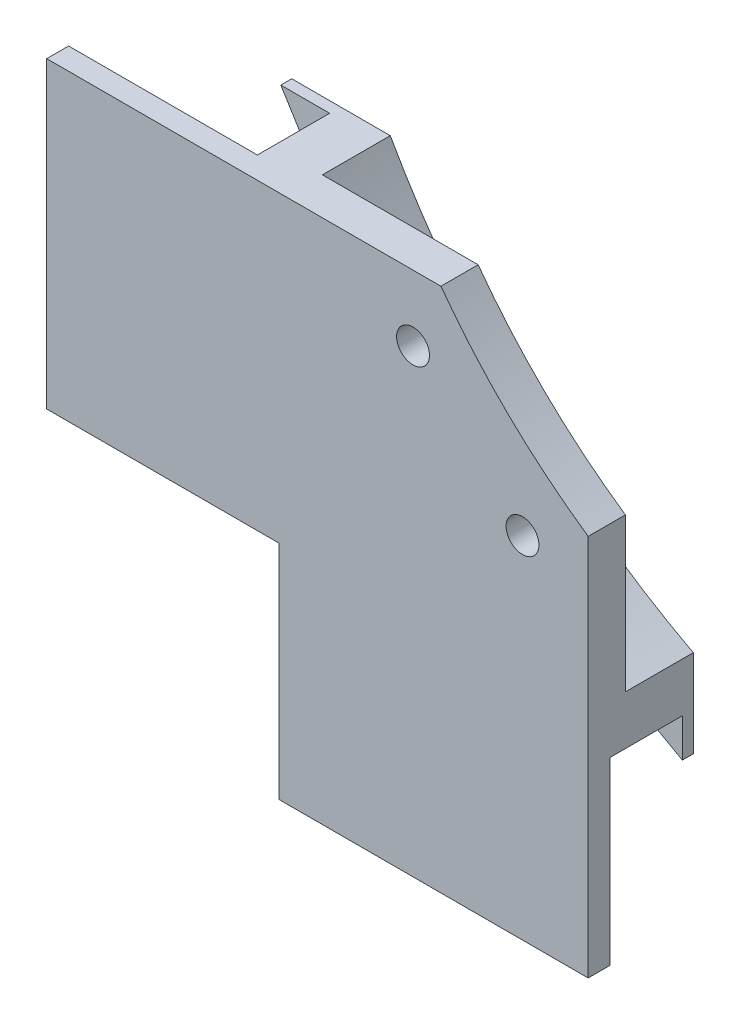
ISO-10303-21;
HEADER;
FILE_DESCRIPTION(('STEP AP214'),'2;1');
FILE_NAME('part.step','',(''),(''),'','','');
FILE_SCHEMA(('AUTOMOTIVE_DESIGN { 1 0 10303 214 1 1 1 1 }'));
ENDSEC;
DATA;
#1=APPLICATION_CONTEXT('core data for automotive mechanical design processes');
#2=APPLICATION_PROTOCOL_DEFINITION('international standard','automotive_design',2000,#1);
#3=PRODUCT_CONTEXT('',#1,'mechanical');
#4=PRODUCT('Part','Part','',(#3));
#5=PRODUCT_RELATED_PRODUCT_CATEGORY('part','',(#4));
#6=PRODUCT_DEFINITION_FORMATION('','',#4);
#7=PRODUCT_DEFINITION_CONTEXT('part definition',#1,'design');
#8=PRODUCT_DEFINITION('design','',#6,#7);
#9=PRODUCT_DEFINITION_SHAPE('','',#8);
#10=(LENGTH_UNIT() NAMED_UNIT(*) SI_UNIT(.MILLI.,.METRE.));
#11=(NAMED_UNIT(*) PLANE_ANGLE_UNIT() SI_UNIT($,.RADIAN.));
#12=(NAMED_UNIT(*) SI_UNIT($,.STERADIAN.) SOLID_ANGLE_UNIT());
#13=UNCERTAINTY_MEASURE_WITH_UNIT(LENGTH_MEASURE(1.E-05),#10,'distance_accuracy_value','');
#14=(GEOMETRIC_REPRESENTATION_CONTEXT(3) GLOBAL_UNCERTAINTY_ASSIGNED_CONTEXT((#13)) GLOBAL_UNIT_ASSIGNED_CONTEXT((#10,
#11,#12)) REPRESENTATION_CONTEXT('',''));
#15=CARTESIAN_POINT('',(0.,0.,0.));
#16=DIRECTION('',(0.,0.,1.));
#17=DIRECTION('',(1.,0.,0.));
#18=AXIS2_PLACEMENT_3D('',#15,#16,#17);
#19=CARTESIAN_POINT('',(-21.7462981425114,-22.2666121239409,-0.2));
#20=DIRECTION('',(0.,0.,1.));
#21=DIRECTION('',(1.,0.,0.));
#22=AXIS2_PLACEMENT_3D('',#19,#20,#21);
#23=PLANE('',#22);
#24=CARTESIAN_POINT('',(-18.867,-24.539,-0.200000000000001));
#25=DIRECTION('',(0.,0.,-1.));
#26=DIRECTION('',(-1.,0.,0.));
#27=AXIS2_PLACEMENT_3D('',#24,#25,#26);
#28=CIRCLE('',#27,0.74999999999999);
#29=CARTESIAN_POINT('',(-19.617,-24.539,-0.200000000000001));
#30=VERTEX_POINT('',#29);
#31=EDGE_CURVE('E385',#30,#30,#28,.T.);
#32=ORIENTED_EDGE('',*,*,#31,.F.);
#33=EDGE_LOOP('',(#32));
#34=FACE_BOUND('',#33,.T.);
#35=CARTESIAN_POINT('',(2.353673E-13,2.531308E-13,-0.2));
#36=DIRECTION('',(0.,0.,-1.));
#37=DIRECTION('',(-1.,0.,0.));
#38=AXIS2_PLACEMENT_3D('',#35,#36,#37);
#39=CIRCLE('',#38,34.0000000000003);
#40=CARTESIAN_POINT('',(-29.7062531969281,-16.539,-0.2));
#41=VERTEX_POINT('',#40);
#42=CARTESIAN_POINT('',(-15.867,-30.0705555485761,-0.2));
#43=VERTEX_POINT('',#42);
#44=EDGE_CURVE('E224',#41,#43,#39,.F.);
#45=ORIENTED_EDGE('',*,*,#44,.F.);
#46=DIRECTION('',(1.,0.,0.));
#47=VECTOR('',#46,1.);
#48=CARTESIAN_POINT('',(-31.9759515730181,-16.539,-0.2));
#49=LINE('',#48,#47);
#50=CARTESIAN_POINT('',(-22.5933945877993,-16.539,-0.2));
#51=VERTEX_POINT('',#50);
#52=EDGE_CURVE('E211',#51,#41,#49,.F.);
#53=ORIENTED_EDGE('',*,*,#52,.F.);
#54=CARTESIAN_POINT('',(1.487699E-13,1.820766E-13,-0.2));
#55=DIRECTION('',(0.,0.,1.));
#56=DIRECTION('',(1.,0.,0.));
#57=AXIS2_PLACEMENT_3D('',#54,#55,#56);
#58=CIRCLE('',#57,28.0000000000002);
#59=CARTESIAN_POINT('',(-15.867,-23.0702906570333,-0.2));
#60=VERTEX_POINT('',#59);
#61=EDGE_CURVE('E183',#51,#60,#58,.T.);
#62=ORIENTED_EDGE('',*,*,#61,.T.);
#63=DIRECTION('',(0.,1.,0.));
#64=VECTOR('',#63,1.);
#65=CARTESIAN_POINT('',(-15.867,-30.0705555485761,-0.2));
#66=LINE('',#65,#64);
#67=EDGE_CURVE('E245',#43,#60,#66,.T.);
#68=ORIENTED_EDGE('',*,*,#67,.F.);
#69=EDGE_LOOP('',(#45,#53,#62,#68));
#70=FACE_BOUND('',#69,.T.);
#71=CARTESIAN_POINT('',(-23.867,-19.539,-0.200000000000001));
#72=DIRECTION('',(0.,0.,-1.));
#73=DIRECTION('',(-1.,0.,0.));
#74=AXIS2_PLACEMENT_3D('',#71,#72,#73);
#75=CIRCLE('',#74,0.749999999999987);
#76=CARTESIAN_POINT('',(-24.617,-19.539,-0.200000000000001));
#77=VERTEX_POINT('',#76);
#78=EDGE_CURVE('E382',#77,#77,#75,.T.);
#79=ORIENTED_EDGE('',*,*,#78,.F.);
#80=EDGE_LOOP('',(#79));
#81=FACE_BOUND('',#80,.T.);
#82=ADVANCED_FACE('F39',(#34,#70,#81),#23,.F.);
#83=CARTESIAN_POINT('',(6.58231049155936,7.77087780601652,-3.3));
#84=DIRECTION('',(0.,0.,1.));
#85=DIRECTION('',(1.,0.,0.));
#86=AXIS2_PLACEMENT_3D('',#83,#84,#85);
#87=CYLINDRICAL_SURFACE('',#86,47.4834401314106);
#88=CARTESIAN_POINT('',(6.58231049155936,7.77087780601652,-3.3));
#89=DIRECTION('',(0.,0.,1.));
#90=DIRECTION('',(1.,0.,0.));
#91=AXIS2_PLACEMENT_3D('',#88,#89,#90);
#92=CIRCLE('',#91,47.4834401314106);
#93=CARTESIAN_POINT('',(-34.2062531969281,-16.539,-3.3));
#94=VERTEX_POINT('',#93);
#95=CARTESIAN_POINT('',(-15.867,-34.0705555485761,-3.3));
#96=VERTEX_POINT('',#95);
#97=EDGE_CURVE('E251',#94,#96,#92,.T.);
#98=ORIENTED_EDGE('',*,*,#97,.T.);
#99=DIRECTION('',(0.,0.,1.));
#100=VECTOR('',#99,1.);
#101=CARTESIAN_POINT('',(-15.867,-34.0705555485761,-3.3));
#102=LINE('',#101,#100);
#103=CARTESIAN_POINT('',(-15.867,-34.0705555485761,-2.8));
#104=VERTEX_POINT('',#103);
#105=EDGE_CURVE('E237',#96,#104,#102,.T.);
#106=ORIENTED_EDGE('',*,*,#105,.T.);
#107=CARTESIAN_POINT('',(6.58231049155936,7.77087780601652,-2.8));
#108=DIRECTION('',(0.,0.,1.));
#109=DIRECTION('',(1.,0.,0.));
#110=AXIS2_PLACEMENT_3D('',#107,#108,#109);
#111=CIRCLE('',#110,47.4834401314106);
#112=CARTESIAN_POINT('',(-34.2062531969281,-16.539,-2.8));
#113=VERTEX_POINT('',#112);
#114=EDGE_CURVE('E255',#113,#104,#111,.T.);
#115=ORIENTED_EDGE('',*,*,#114,.F.);
#116=DIRECTION('',(0.,0.,1.));
#117=VECTOR('',#116,1.);
#118=CARTESIAN_POINT('',(-34.2062531969281,-16.539,-3.3));
#119=LINE('',#118,#117);
#120=EDGE_CURVE('E234',#113,#94,#119,.F.);
#121=ORIENTED_EDGE('',*,*,#120,.T.);
#122=EDGE_LOOP('',(#98,#106,#115,#121));
#123=FACE_BOUND('',#122,.T.);
#124=ADVANCED_FACE('F41',(#123),#87,.T.);
#125=CARTESIAN_POINT('',(-29.0842068014852,-29.3746859314976,0.5));
#126=DIRECTION('',(0.,0.,1.));
#127=DIRECTION('',(1.,0.,0.));
#128=AXIS2_PLACEMENT_3D('',#125,#126,#127);
#129=PLANE('',#128);
#130=DIRECTION('',(1.,0.,0.));
#131=VECTOR('',#130,1.);
#132=CARTESIAN_POINT('',(-29.9782912006115,-40.5391777062058,0.5));
#133=LINE('',#132,#131);
#134=CARTESIAN_POINT('',(-29.9782912006115,-40.5391777062058,0.5));
#135=VERTEX_POINT('',#134);
#136=CARTESIAN_POINT('',(-15.867,-40.5391777062058,0.5));
#137=VERTEX_POINT('',#136);
#138=EDGE_CURVE('E135',#135,#137,#133,.T.);
#139=ORIENTED_EDGE('',*,*,#138,.F.);
#140=DIRECTION('',(0.,-1.,0.));
#141=VECTOR('',#140,1.);
#142=CARTESIAN_POINT('',(-29.9782912006115,-30.399,0.5));
#143=LINE('',#142,#141);
#144=CARTESIAN_POINT('',(-29.9782912006115,-30.399,0.5));
#145=VERTEX_POINT('',#144);
#146=EDGE_CURVE('E363',#145,#135,#143,.T.);
#147=ORIENTED_EDGE('',*,*,#146,.F.);
#148=DIRECTION('',(1.,0.,0.));
#149=VECTOR('',#148,1.);
#150=CARTESIAN_POINT('',(-40.5982912006115,-30.399,0.5));
#151=LINE('',#150,#149);
#152=CARTESIAN_POINT('',(-40.5982912006115,-30.399,0.5));
#153=VERTEX_POINT('',#152);
#154=EDGE_CURVE('E380',#153,#145,#151,.T.);
#155=ORIENTED_EDGE('',*,*,#154,.F.);
#156=DIRECTION('',(0.,1.,0.));
#157=VECTOR('',#156,1.);
#158=CARTESIAN_POINT('',(-40.5982912006115,-16.539,0.5));
#159=LINE('',#158,#157);
#160=CARTESIAN_POINT('',(-40.5982912006115,-16.539,0.5));
#161=VERTEX_POINT('',#160);
#162=EDGE_CURVE('E127',#161,#153,#159,.F.);
#163=ORIENTED_EDGE('',*,*,#162,.F.);
#164=DIRECTION('',(1.,0.,0.));
#165=VECTOR('',#164,1.);
#166=CARTESIAN_POINT('',(-31.9759515730181,-16.539,0.5));
#167=LINE('',#166,#165);
#168=CARTESIAN_POINT('',(-31.9759515730181,-16.539,0.5));
#169=VERTEX_POINT('',#168);
#170=EDGE_CURVE('E149',#169,#161,#167,.F.);
#171=ORIENTED_EDGE('',*,*,#170,.F.);
#172=CARTESIAN_POINT('',(1.953993E-13,1.953993E-13,0.5));
#173=DIRECTION('',(0.,0.,1.));
#174=DIRECTION('',(1.,0.,0.));
#175=AXIS2_PLACEMENT_3D('',#172,#173,#174);
#176=CIRCLE('',#175,36.0000000000003);
#177=CARTESIAN_POINT('',(-15.867,-32.3146764025265,0.5));
#178=VERTEX_POINT('',#177);
#179=EDGE_CURVE('E121',#178,#169,#176,.F.);
#180=ORIENTED_EDGE('',*,*,#179,.F.);
#181=DIRECTION('',(0.,1.,0.));
#182=VECTOR('',#181,1.);
#183=CARTESIAN_POINT('',(-15.867,-30.0705555485761,0.5));
#184=LINE('',#183,#182);
#185=EDGE_CURVE('E189',#137,#178,#184,.T.);
#186=ORIENTED_EDGE('',*,*,#185,.F.);
#187=EDGE_LOOP('',(#139,#147,#155,#163,#171,#180,#186));
#188=FACE_BOUND('',#187,.T.);
#189=ADVANCED_FACE('F354',(#188),#129,.F.);
#190=CARTESIAN_POINT('',(1.953993E-13,1.953993E-13,0.));
#191=DIRECTION('',(0.,0.,1.));
#192=DIRECTION('',(1.,0.,0.));
#193=AXIS2_PLACEMENT_3D('',#190,#191,#192);
#194=CYLINDRICAL_SURFACE('',#193,36.0000000000003);
#195=CARTESIAN_POINT('',(1.953993E-13,1.953993E-13,-2.8));
#196=DIRECTION('',(0.,0.,1.));
#197=DIRECTION('',(1.,0.,0.));
#198=AXIS2_PLACEMENT_3D('',#195,#196,#197);
#199=CIRCLE('',#198,36.0000000000003);
#200=CARTESIAN_POINT('',(-15.867,-32.3146764025265,-2.8));
#201=VERTEX_POINT('',#200);
#202=CARTESIAN_POINT('',(-31.9759515730181,-16.539,-2.8));
#203=VERTEX_POINT('',#202);
#204=EDGE_CURVE('E258',#201,#203,#199,.F.);
#205=ORIENTED_EDGE('',*,*,#204,.F.);
#206=DIRECTION('',(0.,0.,-1.));
#207=VECTOR('',#206,1.);
#208=CARTESIAN_POINT('',(-15.867,-32.3146764025265,0.));
#209=LINE('',#208,#207);
#210=EDGE_CURVE('E417',#178,#201,#209,.T.);
#211=ORIENTED_EDGE('',*,*,#210,.F.);
#212=ORIENTED_EDGE('',*,*,#179,.T.);
#213=DIRECTION('',(0.,0.,1.));
#214=VECTOR('',#213,1.);
#215=CARTESIAN_POINT('',(-31.9759515730181,-16.539,0.));
#216=LINE('',#215,#214);
#217=EDGE_CURVE('E216',#203,#169,#216,.T.);
#218=ORIENTED_EDGE('',*,*,#217,.F.);
#219=EDGE_LOOP('',(#205,#211,#212,#218));
#220=FACE_BOUND('',#219,.T.);
#221=ADVANCED_FACE('F352',(#220),#194,.T.);
#222=CARTESIAN_POINT('',(-24.6690089548896,-24.9217832145669,-2.8));
#223=DIRECTION('',(0.,0.,1.));
#224=DIRECTION('',(1.,0.,0.));
#225=AXIS2_PLACEMENT_3D('',#222,#223,#224);
#226=PLANE('',#225);
#227=ORIENTED_EDGE('',*,*,#114,.T.);
#228=DIRECTION('',(0.,1.,0.));
#229=VECTOR('',#228,1.);
#230=CARTESIAN_POINT('',(-15.867,-30.0705555485761,-2.8));
#231=LINE('',#230,#229);
#232=EDGE_CURVE('E416',#201,#104,#231,.F.);
#233=ORIENTED_EDGE('',*,*,#232,.F.);
#234=ORIENTED_EDGE('',*,*,#204,.T.);
#235=DIRECTION('',(1.,0.,0.));
#236=VECTOR('',#235,1.);
#237=CARTESIAN_POINT('',(-31.9759515730181,-16.539,-2.8));
#238=LINE('',#237,#236);
#239=EDGE_CURVE('E227',#113,#203,#238,.T.);
#240=ORIENTED_EDGE('',*,*,#239,.F.);
#241=EDGE_LOOP('',(#227,#233,#234,#240));
#242=FACE_BOUND('',#241,.T.);
#243=ADVANCED_FACE('F348',(#242),#226,.T.);
#244=CARTESIAN_POINT('',(-24.6690089548896,-24.9217832145669,-3.3));
#245=DIRECTION('',(0.,0.,1.));
#246=DIRECTION('',(1.,0.,0.));
#247=AXIS2_PLACEMENT_3D('',#244,#245,#246);
#248=PLANE('',#247);
#249=DIRECTION('',(0.,1.,0.));
#250=VECTOR('',#249,1.);
#251=CARTESIAN_POINT('',(-15.867,-30.0705555485761,-3.3));
#252=LINE('',#251,#250);
#253=CARTESIAN_POINT('',(-15.867,-30.0705555485761,-3.3));
#254=VERTEX_POINT('',#253);
#255=EDGE_CURVE('E412',#96,#254,#252,.T.);
#256=ORIENTED_EDGE('',*,*,#255,.F.);
#257=ORIENTED_EDGE('',*,*,#97,.F.);
#258=DIRECTION('',(1.,0.,0.));
#259=VECTOR('',#258,1.);
#260=CARTESIAN_POINT('',(-31.9759515730181,-16.539,-3.3));
#261=LINE('',#260,#259);
#262=CARTESIAN_POINT('',(-29.7062531969281,-16.539,-3.3));
#263=VERTEX_POINT('',#262);
#264=EDGE_CURVE('E223',#263,#94,#261,.F.);
#265=ORIENTED_EDGE('',*,*,#264,.F.);
#266=CARTESIAN_POINT('',(2.353673E-13,2.531308E-13,-3.3));
#267=DIRECTION('',(0.,0.,-1.));
#268=DIRECTION('',(-1.,0.,0.));
#269=AXIS2_PLACEMENT_3D('',#266,#267,#268);
#270=CIRCLE('',#269,34.0000000000003);
#271=EDGE_CURVE('E248',#263,#254,#270,.F.);
#272=ORIENTED_EDGE('',*,*,#271,.T.);
#273=EDGE_LOOP('',(#256,#257,#265,#272));
#274=FACE_BOUND('',#273,.T.);
#275=ADVANCED_FACE('F344',(#274),#248,.F.);
#276=CARTESIAN_POINT('',(2.353673E-13,2.531308E-13,0.));
#277=DIRECTION('',(0.,0.,-1.));
#278=DIRECTION('',(-1.,0.,0.));
#279=AXIS2_PLACEMENT_3D('',#276,#277,#278);
#280=CYLINDRICAL_SURFACE('',#279,34.0000000000003);
#281=DIRECTION('',(0.,0.,-1.));
#282=VECTOR('',#281,1.);
#283=CARTESIAN_POINT('',(-15.867,-30.0705555485761,0.));
#284=LINE('',#283,#282);
#285=EDGE_CURVE('E409',#254,#43,#284,.F.);
#286=ORIENTED_EDGE('',*,*,#285,.F.);
#287=ORIENTED_EDGE('',*,*,#271,.F.);
#288=DIRECTION('',(0.,0.,1.));
#289=VECTOR('',#288,1.);
#290=CARTESIAN_POINT('',(-29.7062531969281,-16.539,0.));
#291=LINE('',#290,#289);
#292=EDGE_CURVE('E219',#41,#263,#291,.F.);
#293=ORIENTED_EDGE('',*,*,#292,.F.);
#294=ORIENTED_EDGE('',*,*,#44,.T.);
#295=EDGE_LOOP('',(#286,#287,#293,#294));
#296=FACE_BOUND('',#295,.T.);
#297=ADVANCED_FACE('F340',(#296),#280,.F.);
#298=CARTESIAN_POINT('',(-31.9759515730181,-16.539,0.));
#299=DIRECTION('',(0.,1.,0.));
#300=DIRECTION('',(0.,0.,1.));
#301=AXIS2_PLACEMENT_3D('',#298,#299,#300);
#302=PLANE('',#301);
#303=DIRECTION('',(0.,0.,1.));
#304=VECTOR('',#303,1.);
#305=CARTESIAN_POINT('',(-22.5933945877993,-16.539,0.));
#306=LINE('',#305,#304);
#307=CARTESIAN_POINT('',(-22.5933945877993,-16.539,1.5));
#308=VERTEX_POINT('',#307);
#309=EDGE_CURVE('E171',#308,#51,#306,.F.);
#310=ORIENTED_EDGE('',*,*,#309,.T.);
#311=ORIENTED_EDGE('',*,*,#52,.T.);
#312=ORIENTED_EDGE('',*,*,#292,.T.);
#313=ORIENTED_EDGE('',*,*,#264,.T.);
#314=ORIENTED_EDGE('',*,*,#120,.F.);
#315=ORIENTED_EDGE('',*,*,#239,.T.);
#316=ORIENTED_EDGE('',*,*,#217,.T.);
#317=ORIENTED_EDGE('',*,*,#170,.T.);
#318=DIRECTION('',(0.,0.,1.));
#319=VECTOR('',#318,1.);
#320=CARTESIAN_POINT('',(-40.5982912006115,-16.539,1.5));
#321=LINE('',#320,#319);
#322=CARTESIAN_POINT('',(-40.5982912006115,-16.539,1.5));
#323=VERTEX_POINT('',#322);
#324=EDGE_CURVE('E141',#323,#161,#321,.F.);
#325=ORIENTED_EDGE('',*,*,#324,.F.);
#326=DIRECTION('',(1.,0.,0.));
#327=VECTOR('',#326,1.);
#328=CARTESIAN_POINT('',(-22.5849521676809,-16.539,1.5));
#329=LINE('',#328,#327);
#330=EDGE_CURVE('E146',#308,#323,#329,.F.);
#331=ORIENTED_EDGE('',*,*,#330,.F.);
#332=EDGE_LOOP('',(#310,#311,#312,#313,#314,#315,#316,#317,#325,#331));
#333=FACE_BOUND('',#332,.T.);
#334=ADVANCED_FACE('F144',(#333),#302,.T.);
#335=CARTESIAN_POINT('',(-40.5982912006115,-16.539,1.5));
#336=DIRECTION('',(-1.,0.,0.));
#337=DIRECTION('',(0.,0.,1.));
#338=AXIS2_PLACEMENT_3D('',#335,#336,#337);
#339=PLANE('',#338);
#340=DIRECTION('',(0.,0.,-1.));
#341=VECTOR('',#340,1.);
#342=CARTESIAN_POINT('',(-40.5982912006115,-30.399,1.50010307764072));
#343=LINE('',#342,#341);
#344=CARTESIAN_POINT('',(-40.5982912006115,-30.399,1.5));
#345=VERTEX_POINT('',#344);
#346=EDGE_CURVE('E159',#345,#153,#343,.T.);
#347=ORIENTED_EDGE('',*,*,#346,.F.);
#348=DIRECTION('',(0.,1.,0.));
#349=VECTOR('',#348,1.);
#350=CARTESIAN_POINT('',(-40.5982912006115,-23.0932374273808,1.5));
#351=LINE('',#350,#349);
#352=EDGE_CURVE('E155',#323,#345,#351,.F.);
#353=ORIENTED_EDGE('',*,*,#352,.F.);
#354=ORIENTED_EDGE('',*,*,#324,.T.);
#355=ORIENTED_EDGE('',*,*,#162,.T.);
#356=EDGE_LOOP('',(#347,#353,#354,#355));
#357=FACE_BOUND('',#356,.T.);
#358=ADVANCED_FACE('F156',(#357),#339,.T.);
#359=CARTESIAN_POINT('',(-29.9782912006115,-40.5391777062058,1.5));
#360=DIRECTION('',(0.,-1.,0.));
#361=DIRECTION('',(0.,0.,-1.));
#362=AXIS2_PLACEMENT_3D('',#359,#360,#361);
#363=PLANE('',#362);
#364=DIRECTION('',(0.,0.,-1.));
#365=VECTOR('',#364,1.);
#366=CARTESIAN_POINT('',(-29.9782912006115,-40.5391777062058,1.50010307764072));
#367=LINE('',#366,#365);
#368=CARTESIAN_POINT('',(-29.9782912006115,-40.5391777062058,1.5));
#369=VERTEX_POINT('',#368);
#370=EDGE_CURVE('E238',#369,#135,#367,.T.);
#371=ORIENTED_EDGE('',*,*,#370,.T.);
#372=ORIENTED_EDGE('',*,*,#138,.T.);
#373=DIRECTION('',(0.,0.,-1.));
#374=VECTOR('',#373,1.);
#375=CARTESIAN_POINT('',(-15.867,-40.5391777062058,0.));
#376=LINE('',#375,#374);
#377=CARTESIAN_POINT('',(-15.867,-40.5391777062058,1.5));
#378=VERTEX_POINT('',#377);
#379=EDGE_CURVE('E185',#378,#137,#376,.T.);
#380=ORIENTED_EDGE('',*,*,#379,.F.);
#381=DIRECTION('',(1.,0.,0.));
#382=VECTOR('',#381,1.);
#383=CARTESIAN_POINT('',(-22.5849521676809,-40.5391777062058,1.5));
#384=LINE('',#383,#382);
#385=EDGE_CURVE('E163',#369,#378,#384,.T.);
#386=ORIENTED_EDGE('',*,*,#385,.F.);
#387=EDGE_LOOP('',(#371,#372,#380,#386));
#388=FACE_BOUND('',#387,.T.);
#389=ADVANCED_FACE('F334',(#388),#363,.T.);
#390=CARTESIAN_POINT('',(-15.867,-30.0705555485761,0.));
#391=DIRECTION('',(1.,0.,0.));
#392=DIRECTION('',(0.,0.,-1.));
#393=AXIS2_PLACEMENT_3D('',#390,#391,#392);
#394=PLANE('',#393);
#395=ORIENTED_EDGE('',*,*,#285,.T.);
#396=ORIENTED_EDGE('',*,*,#67,.T.);
#397=DIRECTION('',(0.,0.,1.));
#398=VECTOR('',#397,1.);
#399=CARTESIAN_POINT('',(-15.867,-23.0702906570333,0.));
#400=LINE('',#399,#398);
#401=CARTESIAN_POINT('',(-15.867,-23.0702906570333,1.5));
#402=VERTEX_POINT('',#401);
#403=EDGE_CURVE('E64',#60,#402,#400,.T.);
#404=ORIENTED_EDGE('',*,*,#403,.T.);
#405=DIRECTION('',(0.,1.,0.));
#406=VECTOR('',#405,1.);
#407=CARTESIAN_POINT('',(-15.867,-23.0932374273808,1.5));
#408=LINE('',#407,#406);
#409=EDGE_CURVE('E198',#378,#402,#408,.T.);
#410=ORIENTED_EDGE('',*,*,#409,.F.);
#411=ORIENTED_EDGE('',*,*,#379,.T.);
#412=ORIENTED_EDGE('',*,*,#185,.T.);
#413=ORIENTED_EDGE('',*,*,#210,.T.);
#414=ORIENTED_EDGE('',*,*,#232,.T.);
#415=ORIENTED_EDGE('',*,*,#105,.F.);
#416=ORIENTED_EDGE('',*,*,#255,.T.);
#417=EDGE_LOOP('',(#395,#396,#404,#410,#411,#412,#413,#414,#415,#416));
#418=FACE_BOUND('',#417,.T.);
#419=ADVANCED_FACE('F330',(#418),#394,.T.);
#420=CARTESIAN_POINT('',(1.487699E-13,1.820766E-13,0.));
#421=DIRECTION('',(0.,0.,1.));
#422=DIRECTION('',(1.,0.,0.));
#423=AXIS2_PLACEMENT_3D('',#420,#421,#422);
#424=CYLINDRICAL_SURFACE('',#423,28.0000000000002);
#425=CARTESIAN_POINT('',(1.487699E-13,1.820766E-13,1.5));
#426=DIRECTION('',(0.,0.,1.));
#427=DIRECTION('',(1.,0.,0.));
#428=AXIS2_PLACEMENT_3D('',#425,#426,#427);
#429=CIRCLE('',#428,28.0000000000002);
#430=EDGE_CURVE('E169',#402,#308,#429,.F.);
#431=ORIENTED_EDGE('',*,*,#430,.F.);
#432=ORIENTED_EDGE('',*,*,#403,.F.);
#433=ORIENTED_EDGE('',*,*,#61,.F.);
#434=ORIENTED_EDGE('',*,*,#309,.F.);
#435=EDGE_LOOP('',(#431,#432,#433,#434));
#436=FACE_BOUND('',#435,.T.);
#437=ADVANCED_FACE('F295',(#436),#424,.F.);
#438=CARTESIAN_POINT('',(-22.5849521676809,-23.0932374273808,1.5));
#439=DIRECTION('',(0.,0.,1.));
#440=DIRECTION('',(1.,0.,0.));
#441=AXIS2_PLACEMENT_3D('',#438,#439,#440);
#442=PLANE('',#441);
#443=CARTESIAN_POINT('',(-18.867,-24.539,1.5));
#444=DIRECTION('',(0.,0.,1.));
#445=DIRECTION('',(1.,0.,0.));
#446=AXIS2_PLACEMENT_3D('',#443,#444,#445);
#447=CIRCLE('',#446,0.749999999999989);
#448=CARTESIAN_POINT('',(-18.117,-24.539,1.5));
#449=VERTEX_POINT('',#448);
#450=EDGE_CURVE('E43',#449,#449,#447,.T.);
#451=ORIENTED_EDGE('',*,*,#450,.F.);
#452=EDGE_LOOP('',(#451));
#453=FACE_BOUND('',#452,.T.);
#454=CARTESIAN_POINT('',(-23.867,-19.539,1.5));
#455=DIRECTION('',(0.,0.,1.));
#456=DIRECTION('',(1.,0.,0.));
#457=AXIS2_PLACEMENT_3D('',#454,#455,#456);
#458=CIRCLE('',#457,0.749999999999987);
#459=CARTESIAN_POINT('',(-23.117,-19.539,1.5));
#460=VERTEX_POINT('',#459);
#461=EDGE_CURVE('E203',#460,#460,#458,.T.);
#462=ORIENTED_EDGE('',*,*,#461,.F.);
#463=EDGE_LOOP('',(#462));
#464=FACE_BOUND('',#463,.T.);
#465=DIRECTION('',(0.,1.,0.));
#466=VECTOR('',#465,1.);
#467=CARTESIAN_POINT('',(-29.9782912006115,-23.0932374273808,1.5));
#468=LINE('',#467,#466);
#469=CARTESIAN_POINT('',(-29.9782912006114,-30.399,1.5));
#470=VERTEX_POINT('',#469);
#471=EDGE_CURVE('E11',#369,#470,#468,.T.);
#472=ORIENTED_EDGE('',*,*,#471,.F.);
#473=ORIENTED_EDGE('',*,*,#385,.T.);
#474=ORIENTED_EDGE('',*,*,#409,.T.);
#475=ORIENTED_EDGE('',*,*,#430,.T.);
#476=ORIENTED_EDGE('',*,*,#330,.T.);
#477=ORIENTED_EDGE('',*,*,#352,.T.);
#478=DIRECTION('',(-1.,0.,0.));
#479=VECTOR('',#478,1.);
#480=CARTESIAN_POINT('',(-22.5849521676809,-30.399,1.5));
#481=LINE('',#480,#479);
#482=EDGE_CURVE('E48',#470,#345,#481,.T.);
#483=ORIENTED_EDGE('',*,*,#482,.F.);
#484=EDGE_LOOP('',(#472,#473,#474,#475,#476,#477,#483));
#485=FACE_BOUND('',#484,.T.);
#486=ADVANCED_FACE('F167',(#453,#464,#485),#442,.T.);
#487=CARTESIAN_POINT('',(-29.9782912006115,-30.399,1.50010307764072));
#488=DIRECTION('',(1.,0.,0.));
#489=DIRECTION('',(0.,0.,-1.));
#490=AXIS2_PLACEMENT_3D('',#487,#488,#489);
#491=PLANE('',#490);
#492=ORIENTED_EDGE('',*,*,#471,.T.);
#493=DIRECTION('',(0.,0.,-1.));
#494=VECTOR('',#493,1.);
#495=CARTESIAN_POINT('',(-29.9782912006115,-30.399,1.50010307764072));
#496=LINE('',#495,#494);
#497=EDGE_CURVE('E56',#470,#145,#496,.T.);
#498=ORIENTED_EDGE('',*,*,#497,.T.);
#499=ORIENTED_EDGE('',*,*,#146,.T.);
#500=ORIENTED_EDGE('',*,*,#370,.F.);
#501=EDGE_LOOP('',(#492,#498,#499,#500));
#502=FACE_BOUND('',#501,.T.);
#503=ADVANCED_FACE('F294',(#502),#491,.F.);
#504=CARTESIAN_POINT('',(-40.5982912006115,-30.399,1.50010307764072));
#505=DIRECTION('',(0.,1.,0.));
#506=DIRECTION('',(0.,0.,1.));
#507=AXIS2_PLACEMENT_3D('',#504,#505,#506);
#508=PLANE('',#507);
#509=ORIENTED_EDGE('',*,*,#482,.T.);
#510=ORIENTED_EDGE('',*,*,#346,.T.);
#511=ORIENTED_EDGE('',*,*,#154,.T.);
#512=ORIENTED_EDGE('',*,*,#497,.F.);
#513=EDGE_LOOP('',(#509,#510,#511,#512));
#514=FACE_BOUND('',#513,.T.);
#515=ADVANCED_FACE('F286',(#514),#508,.F.);
#516=CARTESIAN_POINT('',(-23.867,-19.539,-0.2));
#517=DIRECTION('',(0.,0.,-1.));
#518=DIRECTION('',(-1.,0.,0.));
#519=AXIS2_PLACEMENT_3D('',#516,#517,#518);
#520=CYLINDRICAL_SURFACE('',#519,0.749999999999987);
#521=ORIENTED_EDGE('',*,*,#461,.T.);
#522=EDGE_LOOP('',(#521));
#523=FACE_BOUND('',#522,.T.);
#524=ORIENTED_EDGE('',*,*,#78,.T.);
#525=EDGE_LOOP('',(#524));
#526=FACE_BOUND('',#525,.T.);
#527=ADVANCED_FACE('F305',(#523,#526),#520,.F.);
#528=CARTESIAN_POINT('',(-18.867,-24.539,-0.2));
#529=DIRECTION('',(0.,0.,-1.));
#530=DIRECTION('',(-1.,0.,0.));
#531=AXIS2_PLACEMENT_3D('',#528,#529,#530);
#532=CYLINDRICAL_SURFACE('',#531,0.749999999999989);
#533=ORIENTED_EDGE('',*,*,#450,.T.);
#534=EDGE_LOOP('',(#533));
#535=FACE_BOUND('',#534,.T.);
#536=ORIENTED_EDGE('',*,*,#31,.T.);
#537=EDGE_LOOP('',(#536));
#538=FACE_BOUND('',#537,.T.);
#539=ADVANCED_FACE('F309',(#535,#538),#532,.F.);
#540=CLOSED_SHELL('',(#82,#124,#189,#221,#243,#275,#297,#334,#358,#389,#419,#437,#486,#503,#515,
#527,#539));
#541=MANIFOLD_SOLID_BREP('B2',#540);
#542=ADVANCED_BREP_SHAPE_REPRESENTATION('',(#18,#541),#14);
#543=SHAPE_DEFINITION_REPRESENTATION(#9,#542);
ENDSEC;
END-ISO-10303-21;
